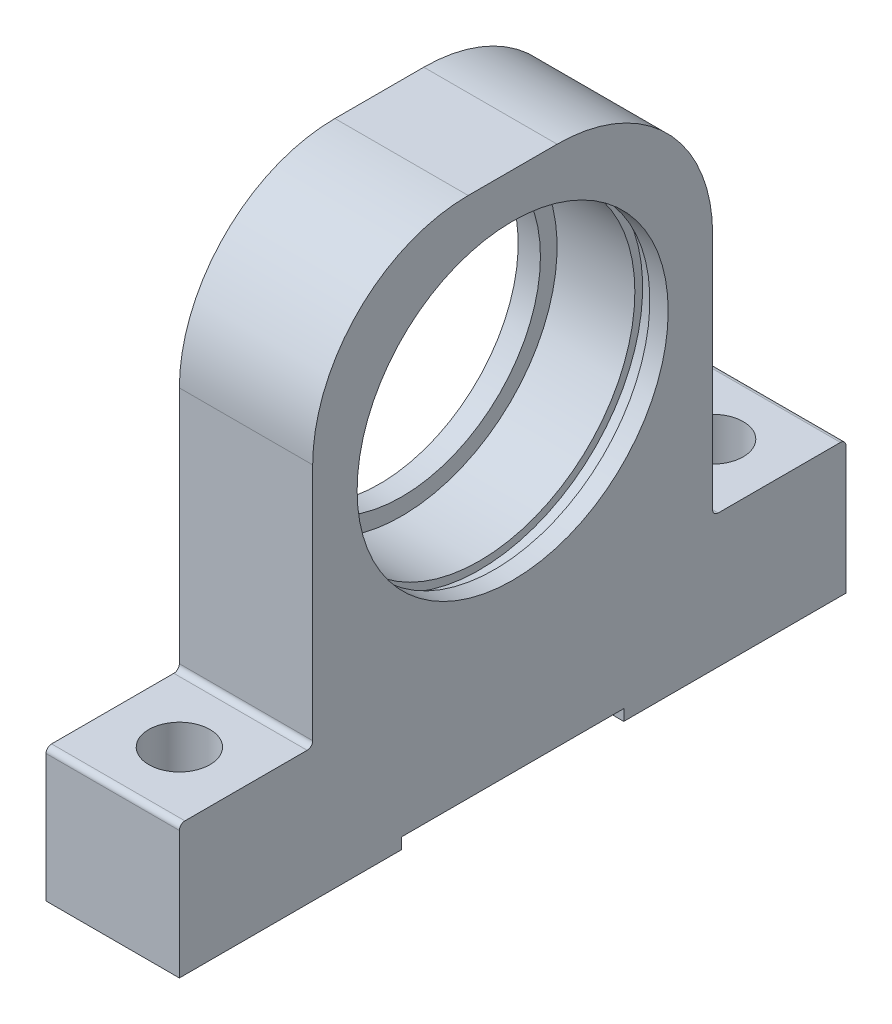
ISO-10303-21;
HEADER;
FILE_DESCRIPTION(('STEP AP214'),'2;1');
FILE_NAME('part.step','',(''),(''),'','','');
FILE_SCHEMA(('AUTOMOTIVE_DESIGN { 1 0 10303 214 1 1 1 1 }'));
ENDSEC;
DATA;
#1=APPLICATION_CONTEXT('core data for automotive mechanical design processes');
#2=APPLICATION_PROTOCOL_DEFINITION('international standard','automotive_design',2000,#1);
#3=PRODUCT_CONTEXT('',#1,'mechanical');
#4=PRODUCT('Part','Part','',(#3));
#5=PRODUCT_RELATED_PRODUCT_CATEGORY('part','',(#4));
#6=PRODUCT_DEFINITION_FORMATION('','',#4);
#7=PRODUCT_DEFINITION_CONTEXT('part definition',#1,'design');
#8=PRODUCT_DEFINITION('design','',#6,#7);
#9=PRODUCT_DEFINITION_SHAPE('','',#8);
#10=(LENGTH_UNIT() NAMED_UNIT(*) SI_UNIT(.MILLI.,.METRE.));
#11=(NAMED_UNIT(*) PLANE_ANGLE_UNIT() SI_UNIT($,.RADIAN.));
#12=(NAMED_UNIT(*) SI_UNIT($,.STERADIAN.) SOLID_ANGLE_UNIT());
#13=UNCERTAINTY_MEASURE_WITH_UNIT(LENGTH_MEASURE(1.E-05),#10,'distance_accuracy_value','');
#14=(GEOMETRIC_REPRESENTATION_CONTEXT(3) GLOBAL_UNCERTAINTY_ASSIGNED_CONTEXT((#13)) GLOBAL_UNIT_ASSIGNED_CONTEXT((#10,
#11,#12)) REPRESENTATION_CONTEXT('',''));
#15=CARTESIAN_POINT('',(0.,0.,0.));
#16=DIRECTION('',(0.,0.,1.));
#17=DIRECTION('',(1.,0.,0.));
#18=AXIS2_PLACEMENT_3D('',#15,#16,#17);
#19=CARTESIAN_POINT('',(6.,-18.5000000000009,29.4999999999991));
#20=DIRECTION('',(-1.,0.,0.));
#21=DIRECTION('',(0.,0.,1.));
#22=AXIS2_PLACEMENT_3D('',#19,#20,#21);
#23=CYLINDRICAL_SURFACE('',#22,0.500000000000927);
#24=CARTESIAN_POINT('',(-6.,-18.5000000000009,29.4999999999991));
#25=DIRECTION('',(1.,0.,0.));
#26=DIRECTION('',(0.,1.,1.89714910447595E-12));
#27=AXIS2_PLACEMENT_3D('',#24,#25,#26);
#28=CIRCLE('',#27,0.500000000000927);
#29=CARTESIAN_POINT('',(-6.,-18.,29.5));
#30=VERTEX_POINT('',#29);
#31=CARTESIAN_POINT('',(-6.,-18.5000000000005,30.));
#32=VERTEX_POINT('',#31);
#33=EDGE_CURVE('E144',#30,#32,#28,.T.);
#34=ORIENTED_EDGE('',*,*,#33,.T.);
#35=DIRECTION('',(1.,0.,0.));
#36=VECTOR('',#35,1.);
#37=CARTESIAN_POINT('',(-6.,-18.5000000000005,30.));
#38=LINE('',#37,#36);
#39=CARTESIAN_POINT('',(6.,-18.5000000000005,30.));
#40=VERTEX_POINT('',#39);
#41=EDGE_CURVE('E158',#40,#32,#38,.F.);
#42=ORIENTED_EDGE('',*,*,#41,.F.);
#43=CARTESIAN_POINT('',(6.,-18.5000000000009,29.4999999999991));
#44=DIRECTION('',(-1.,0.,0.));
#45=DIRECTION('',(0.,9.45021838559181E-13,1.));
#46=AXIS2_PLACEMENT_3D('',#43,#44,#45);
#47=CIRCLE('',#46,0.500000000000927);
#48=CARTESIAN_POINT('',(6.,-18.,29.5));
#49=VERTEX_POINT('',#48);
#50=EDGE_CURVE('E164',#49,#40,#47,.F.);
#51=ORIENTED_EDGE('',*,*,#50,.F.);
#52=DIRECTION('',(-1.,0.,0.));
#53=VECTOR('',#52,1.);
#54=CARTESIAN_POINT('',(6.,-18.,29.5));
#55=LINE('',#54,#53);
#56=EDGE_CURVE('E152',#49,#30,#55,.T.);
#57=ORIENTED_EDGE('',*,*,#56,.T.);
#58=EDGE_LOOP('',(#34,#42,#51,#57));
#59=FACE_BOUND('',#58,.T.);
#60=ADVANCED_FACE('F17',(#59),#23,.T.);
#61=CARTESIAN_POINT('',(6.,-30.,30.));
#62=DIRECTION('',(0.,0.,1.));
#63=DIRECTION('',(0.,1.,0.));
#64=AXIS2_PLACEMENT_3D('',#61,#62,#63);
#65=PLANE('',#64);
#66=DIRECTION('',(0.,-1.,0.));
#67=VECTOR('',#66,1.);
#68=CARTESIAN_POINT('',(-6.,-18.5000000000005,30.));
#69=LINE('',#68,#67);
#70=CARTESIAN_POINT('',(-6.,-30.,30.));
#71=VERTEX_POINT('',#70);
#72=EDGE_CURVE('E140',#32,#71,#69,.T.);
#73=ORIENTED_EDGE('',*,*,#72,.T.);
#74=DIRECTION('',(1.,0.,0.));
#75=VECTOR('',#74,1.);
#76=CARTESIAN_POINT('',(-6.,-30.,30.));
#77=LINE('',#76,#75);
#78=CARTESIAN_POINT('',(6.,-30.,30.));
#79=VERTEX_POINT('',#78);
#80=EDGE_CURVE('E151',#79,#71,#77,.F.);
#81=ORIENTED_EDGE('',*,*,#80,.F.);
#82=DIRECTION('',(0.,1.,0.));
#83=VECTOR('',#82,1.);
#84=CARTESIAN_POINT('',(6.,-30.,30.));
#85=LINE('',#84,#83);
#86=EDGE_CURVE('E163',#40,#79,#85,.F.);
#87=ORIENTED_EDGE('',*,*,#86,.F.);
#88=ORIENTED_EDGE('',*,*,#41,.T.);
#89=EDGE_LOOP('',(#73,#81,#87,#88));
#90=FACE_BOUND('',#89,.T.);
#91=ADVANCED_FACE('F162',(#90),#65,.T.);
#92=CARTESIAN_POINT('',(-6.,-30.,10.));
#93=DIRECTION('',(0.,-1.,0.));
#94=DIRECTION('',(1.,0.,0.));
#95=AXIS2_PLACEMENT_3D('',#92,#93,#94);
#96=PLANE('',#95);
#97=DIRECTION('',(0.,0.,-1.));
#98=VECTOR('',#97,1.);
#99=CARTESIAN_POINT('',(-6.,-30.,30.));
#100=LINE('',#99,#98);
#101=CARTESIAN_POINT('',(-6.,-30.,10.));
#102=VERTEX_POINT('',#101);
#103=EDGE_CURVE('E146',#71,#102,#100,.T.);
#104=ORIENTED_EDGE('',*,*,#103,.T.);
#105=DIRECTION('',(1.,0.,0.));
#106=VECTOR('',#105,1.);
#107=CARTESIAN_POINT('',(-6.,-30.,10.));
#108=LINE('',#107,#106);
#109=CARTESIAN_POINT('',(6.,-30.,10.));
#110=VERTEX_POINT('',#109);
#111=EDGE_CURVE('E186',#110,#102,#108,.F.);
#112=ORIENTED_EDGE('',*,*,#111,.F.);
#113=DIRECTION('',(0.,0.,1.));
#114=VECTOR('',#113,1.);
#115=CARTESIAN_POINT('',(6.,-30.,10.));
#116=LINE('',#115,#114);
#117=EDGE_CURVE('E191',#79,#110,#116,.F.);
#118=ORIENTED_EDGE('',*,*,#117,.F.);
#119=ORIENTED_EDGE('',*,*,#80,.T.);
#120=EDGE_LOOP('',(#104,#112,#118,#119));
#121=FACE_BOUND('',#120,.T.);
#122=CARTESIAN_POINT('',(0.,-30.,24.));
#123=DIRECTION('',(0.,1.,0.));
#124=DIRECTION('',(0.,0.,-1.));
#125=AXIS2_PLACEMENT_3D('',#122,#123,#124);
#126=CIRCLE('',#125,2.75);
#127=CARTESIAN_POINT('',(0.,-30.,21.25));
#128=VERTEX_POINT('',#127);
#129=EDGE_CURVE('E195',#128,#128,#126,.F.);
#130=ORIENTED_EDGE('',*,*,#129,.F.);
#131=EDGE_LOOP('',(#130));
#132=FACE_BOUND('',#131,.T.);
#133=ADVANCED_FACE('F453',(#121,#132),#96,.T.);
#134=CARTESIAN_POINT('',(-6.,-30.,10.));
#135=DIRECTION('',(0.,0.,-1.));
#136=DIRECTION('',(0.,1.,0.));
#137=AXIS2_PLACEMENT_3D('',#134,#135,#136);
#138=PLANE('',#137);
#139=DIRECTION('',(0.,1.,0.));
#140=VECTOR('',#139,1.);
#141=CARTESIAN_POINT('',(-6.,-30.,10.));
#142=LINE('',#141,#140);
#143=CARTESIAN_POINT('',(-6.,-29.,10.));
#144=VERTEX_POINT('',#143);
#145=EDGE_CURVE('E200',#102,#144,#142,.T.);
#146=ORIENTED_EDGE('',*,*,#145,.T.);
#147=DIRECTION('',(1.,0.,0.));
#148=VECTOR('',#147,1.);
#149=CARTESIAN_POINT('',(-6.,-29.,10.));
#150=LINE('',#149,#148);
#151=CARTESIAN_POINT('',(6.,-29.,10.));
#152=VERTEX_POINT('',#151);
#153=EDGE_CURVE('E203',#152,#144,#150,.F.);
#154=ORIENTED_EDGE('',*,*,#153,.F.);
#155=DIRECTION('',(0.,-1.,0.));
#156=VECTOR('',#155,1.);
#157=CARTESIAN_POINT('',(6.,-29.,10.));
#158=LINE('',#157,#156);
#159=EDGE_CURVE('E208',#110,#152,#158,.F.);
#160=ORIENTED_EDGE('',*,*,#159,.F.);
#161=ORIENTED_EDGE('',*,*,#111,.T.);
#162=EDGE_LOOP('',(#146,#154,#160,#161));
#163=FACE_BOUND('',#162,.T.);
#164=ADVANCED_FACE('F458',(#163),#138,.T.);
#165=CARTESIAN_POINT('',(-6.,-29.,-10.));
#166=DIRECTION('',(0.,-1.,0.));
#167=DIRECTION('',(1.,0.,0.));
#168=AXIS2_PLACEMENT_3D('',#165,#166,#167);
#169=PLANE('',#168);
#170=DIRECTION('',(0.,0.,-1.));
#171=VECTOR('',#170,1.);
#172=CARTESIAN_POINT('',(-6.,-29.,10.));
#173=LINE('',#172,#171);
#174=CARTESIAN_POINT('',(-6.,-29.,-10.));
#175=VERTEX_POINT('',#174);
#176=EDGE_CURVE('E212',#144,#175,#173,.T.);
#177=ORIENTED_EDGE('',*,*,#176,.T.);
#178=DIRECTION('',(1.,0.,0.));
#179=VECTOR('',#178,1.);
#180=CARTESIAN_POINT('',(-6.,-29.,-10.));
#181=LINE('',#180,#179);
#182=CARTESIAN_POINT('',(6.,-29.,-10.));
#183=VERTEX_POINT('',#182);
#184=EDGE_CURVE('E217',#183,#175,#181,.F.);
#185=ORIENTED_EDGE('',*,*,#184,.F.);
#186=DIRECTION('',(0.,0.,1.));
#187=VECTOR('',#186,1.);
#188=CARTESIAN_POINT('',(6.,-29.,-10.));
#189=LINE('',#188,#187);
#190=EDGE_CURVE('E222',#152,#183,#189,.F.);
#191=ORIENTED_EDGE('',*,*,#190,.F.);
#192=ORIENTED_EDGE('',*,*,#153,.T.);
#193=EDGE_LOOP('',(#177,#185,#191,#192));
#194=FACE_BOUND('',#193,.T.);
#195=ADVANCED_FACE('F462',(#194),#169,.T.);
#196=CARTESIAN_POINT('',(6.,-30.,-10.));
#197=DIRECTION('',(0.,0.,1.));
#198=DIRECTION('',(0.,1.,0.));
#199=AXIS2_PLACEMENT_3D('',#196,#197,#198);
#200=PLANE('',#199);
#201=DIRECTION('',(0.,-1.,0.));
#202=VECTOR('',#201,1.);
#203=CARTESIAN_POINT('',(-6.,-29.,-10.));
#204=LINE('',#203,#202);
#205=CARTESIAN_POINT('',(-6.,-30.,-10.));
#206=VERTEX_POINT('',#205);
#207=EDGE_CURVE('E226',#175,#206,#204,.T.);
#208=ORIENTED_EDGE('',*,*,#207,.T.);
#209=DIRECTION('',(1.,0.,0.));
#210=VECTOR('',#209,1.);
#211=CARTESIAN_POINT('',(-6.,-30.,-10.));
#212=LINE('',#211,#210);
#213=CARTESIAN_POINT('',(6.,-30.,-10.));
#214=VERTEX_POINT('',#213);
#215=EDGE_CURVE('E231',#214,#206,#212,.F.);
#216=ORIENTED_EDGE('',*,*,#215,.F.);
#217=DIRECTION('',(0.,1.,0.));
#218=VECTOR('',#217,1.);
#219=CARTESIAN_POINT('',(6.,-30.,-10.));
#220=LINE('',#219,#218);
#221=EDGE_CURVE('E236',#183,#214,#220,.F.);
#222=ORIENTED_EDGE('',*,*,#221,.F.);
#223=ORIENTED_EDGE('',*,*,#184,.T.);
#224=EDGE_LOOP('',(#208,#216,#222,#223));
#225=FACE_BOUND('',#224,.T.);
#226=ADVANCED_FACE('F466',(#225),#200,.T.);
#227=CARTESIAN_POINT('',(-6.,-30.,-30.));
#228=DIRECTION('',(0.,-1.,0.));
#229=DIRECTION('',(1.,0.,0.));
#230=AXIS2_PLACEMENT_3D('',#227,#228,#229);
#231=PLANE('',#230);
#232=DIRECTION('',(0.,0.,-1.));
#233=VECTOR('',#232,1.);
#234=CARTESIAN_POINT('',(-6.,-30.,-10.));
#235=LINE('',#234,#233);
#236=CARTESIAN_POINT('',(-6.,-30.,-30.));
#237=VERTEX_POINT('',#236);
#238=EDGE_CURVE('E240',#206,#237,#235,.T.);
#239=ORIENTED_EDGE('',*,*,#238,.T.);
#240=DIRECTION('',(1.,0.,0.));
#241=VECTOR('',#240,1.);
#242=CARTESIAN_POINT('',(-6.,-30.,-30.));
#243=LINE('',#242,#241);
#244=CARTESIAN_POINT('',(6.,-30.,-30.));
#245=VERTEX_POINT('',#244);
#246=EDGE_CURVE('E245',#245,#237,#243,.F.);
#247=ORIENTED_EDGE('',*,*,#246,.F.);
#248=DIRECTION('',(0.,0.,1.));
#249=VECTOR('',#248,1.);
#250=CARTESIAN_POINT('',(6.,-30.,-30.));
#251=LINE('',#250,#249);
#252=EDGE_CURVE('E250',#214,#245,#251,.F.);
#253=ORIENTED_EDGE('',*,*,#252,.F.);
#254=ORIENTED_EDGE('',*,*,#215,.T.);
#255=EDGE_LOOP('',(#239,#247,#253,#254));
#256=FACE_BOUND('',#255,.T.);
#257=CARTESIAN_POINT('',(0.,-30.,-24.));
#258=DIRECTION('',(0.,1.,0.));
#259=DIRECTION('',(0.,0.,-1.));
#260=AXIS2_PLACEMENT_3D('',#257,#258,#259);
#261=CIRCLE('',#260,2.75);
#262=CARTESIAN_POINT('',(0.,-30.,-26.75));
#263=VERTEX_POINT('',#262);
#264=EDGE_CURVE('E254',#263,#263,#261,.F.);
#265=ORIENTED_EDGE('',*,*,#264,.F.);
#266=EDGE_LOOP('',(#265));
#267=FACE_BOUND('',#266,.T.);
#268=ADVANCED_FACE('F470',(#256,#267),#231,.T.);
#269=CARTESIAN_POINT('',(-6.,-30.,-30.));
#270=DIRECTION('',(0.,0.,-1.));
#271=DIRECTION('',(0.,1.,0.));
#272=AXIS2_PLACEMENT_3D('',#269,#270,#271);
#273=PLANE('',#272);
#274=DIRECTION('',(0.,1.,0.));
#275=VECTOR('',#274,1.);
#276=CARTESIAN_POINT('',(-6.,-30.,-30.));
#277=LINE('',#276,#275);
#278=CARTESIAN_POINT('',(-6.,-18.5,-30.));
#279=VERTEX_POINT('',#278);
#280=EDGE_CURVE('E259',#237,#279,#277,.T.);
#281=ORIENTED_EDGE('',*,*,#280,.T.);
#282=DIRECTION('',(1.,0.,0.));
#283=VECTOR('',#282,1.);
#284=CARTESIAN_POINT('',(-6.,-18.5,-30.));
#285=LINE('',#284,#283);
#286=CARTESIAN_POINT('',(6.,-18.5000000000002,-30.));
#287=VERTEX_POINT('',#286);
#288=EDGE_CURVE('E262',#287,#279,#285,.F.);
#289=ORIENTED_EDGE('',*,*,#288,.F.);
#290=DIRECTION('',(0.,-1.,0.));
#291=VECTOR('',#290,1.);
#292=CARTESIAN_POINT('',(6.,-18.5000000000002,-30.));
#293=LINE('',#292,#291);
#294=EDGE_CURVE('E267',#245,#287,#293,.F.);
#295=ORIENTED_EDGE('',*,*,#294,.F.);
#296=ORIENTED_EDGE('',*,*,#246,.T.);
#297=EDGE_LOOP('',(#281,#289,#295,#296));
#298=FACE_BOUND('',#297,.T.);
#299=ADVANCED_FACE('F474',(#298),#273,.T.);
#300=CARTESIAN_POINT('',(6.,-18.5000000000009,-29.4999999999991));
#301=DIRECTION('',(-1.,0.,0.));
#302=DIRECTION('',(0.,1.,-1.89664378292966E-12));
#303=AXIS2_PLACEMENT_3D('',#300,#301,#302);
#304=CYLINDRICAL_SURFACE('',#303,0.500000000000927);
#305=CARTESIAN_POINT('',(-6.,-18.5000000000009,-29.4999999999991));
#306=DIRECTION('',(1.,0.,0.));
#307=DIRECTION('',(0.,1.79767312146972E-12,-1.));
#308=AXIS2_PLACEMENT_3D('',#305,#306,#307);
#309=CIRCLE('',#308,0.500000000000927);
#310=CARTESIAN_POINT('',(-6.,-18.,-29.5));
#311=VERTEX_POINT('',#310);
#312=EDGE_CURVE('E271',#279,#311,#309,.T.);
#313=ORIENTED_EDGE('',*,*,#312,.T.);
#314=DIRECTION('',(1.,0.,0.));
#315=VECTOR('',#314,1.);
#316=CARTESIAN_POINT('',(-6.,-18.,-29.5));
#317=LINE('',#316,#315);
#318=CARTESIAN_POINT('',(6.,-18.,-29.5));
#319=VERTEX_POINT('',#318);
#320=EDGE_CURVE('E276',#319,#311,#317,.F.);
#321=ORIENTED_EDGE('',*,*,#320,.F.);
#322=CARTESIAN_POINT('',(6.,-18.5000000000009,-29.4999999999991));
#323=DIRECTION('',(-1.,0.,0.));
#324=DIRECTION('',(0.,1.,-1.89714910447595E-12));
#325=AXIS2_PLACEMENT_3D('',#322,#323,#324);
#326=CIRCLE('',#325,0.500000000000927);
#327=EDGE_CURVE('E281',#287,#319,#326,.F.);
#328=ORIENTED_EDGE('',*,*,#327,.F.);
#329=ORIENTED_EDGE('',*,*,#288,.T.);
#330=EDGE_LOOP('',(#313,#321,#328,#329));
#331=FACE_BOUND('',#330,.T.);
#332=ADVANCED_FACE('F478',(#331),#304,.T.);
#333=CARTESIAN_POINT('',(-6.,-18.,-18.5));
#334=DIRECTION('',(0.,1.,0.));
#335=DIRECTION('',(1.,0.,0.));
#336=AXIS2_PLACEMENT_3D('',#333,#334,#335);
#337=PLANE('',#336);
#338=DIRECTION('',(0.,0.,1.));
#339=VECTOR('',#338,1.);
#340=CARTESIAN_POINT('',(-6.,-18.,-29.5));
#341=LINE('',#340,#339);
#342=CARTESIAN_POINT('',(-6.,-18.,-18.5));
#343=VERTEX_POINT('',#342);
#344=EDGE_CURVE('E285',#311,#343,#341,.T.);
#345=ORIENTED_EDGE('',*,*,#344,.T.);
#346=DIRECTION('',(1.,0.,0.));
#347=VECTOR('',#346,1.);
#348=CARTESIAN_POINT('',(-6.,-18.,-18.5));
#349=LINE('',#348,#347);
#350=CARTESIAN_POINT('',(6.,-18.,-18.5));
#351=VERTEX_POINT('',#350);
#352=EDGE_CURVE('E290',#351,#343,#349,.F.);
#353=ORIENTED_EDGE('',*,*,#352,.F.);
#354=DIRECTION('',(0.,0.,-1.));
#355=VECTOR('',#354,1.);
#356=CARTESIAN_POINT('',(6.,-18.,-18.5));
#357=LINE('',#356,#355);
#358=EDGE_CURVE('E295',#319,#351,#357,.F.);
#359=ORIENTED_EDGE('',*,*,#358,.F.);
#360=ORIENTED_EDGE('',*,*,#320,.T.);
#361=EDGE_LOOP('',(#345,#353,#359,#360));
#362=FACE_BOUND('',#361,.T.);
#363=CARTESIAN_POINT('',(0.,-18.,-24.));
#364=DIRECTION('',(0.,-1.,0.));
#365=DIRECTION('',(0.,0.,1.));
#366=AXIS2_PLACEMENT_3D('',#363,#364,#365);
#367=CIRCLE('',#366,2.75);
#368=CARTESIAN_POINT('',(0.,-18.,-21.25));
#369=VERTEX_POINT('',#368);
#370=EDGE_CURVE('E299',#369,#369,#367,.T.);
#371=ORIENTED_EDGE('',*,*,#370,.T.);
#372=EDGE_LOOP('',(#371));
#373=FACE_BOUND('',#372,.T.);
#374=ADVANCED_FACE('F482',(#362,#373),#337,.T.);
#375=CARTESIAN_POINT('',(6.,-17.4999999999991,-18.5000000000009));
#376=DIRECTION('',(-1.,0.,0.));
#377=DIRECTION('',(0.,-1.,1.8969654074596E-12));
#378=AXIS2_PLACEMENT_3D('',#375,#376,#377);
#379=CYLINDRICAL_SURFACE('',#378,0.500000000000937);
#380=CARTESIAN_POINT('',(-6.,-17.4999999999991,-18.5000000000009));
#381=DIRECTION('',(-1.,0.,0.));
#382=DIRECTION('',(0.,-1.,1.91135995919108E-12));
#383=AXIS2_PLACEMENT_3D('',#380,#381,#382);
#384=CIRCLE('',#383,0.500000000000937);
#385=CARTESIAN_POINT('',(-6.,-17.4999999999995,-18.));
#386=VERTEX_POINT('',#385);
#387=EDGE_CURVE('E304',#386,#343,#384,.F.);
#388=ORIENTED_EDGE('',*,*,#387,.F.);
#389=DIRECTION('',(1.,0.,0.));
#390=VECTOR('',#389,1.);
#391=CARTESIAN_POINT('',(-6.,-17.4999999999995,-18.));
#392=LINE('',#391,#390);
#393=CARTESIAN_POINT('',(6.,-17.4999999999995,-18.));
#394=VERTEX_POINT('',#393);
#395=EDGE_CURVE('E306',#394,#386,#392,.F.);
#396=ORIENTED_EDGE('',*,*,#395,.F.);
#397=CARTESIAN_POINT('',(6.,-17.4999999999991,-18.5000000000009));
#398=DIRECTION('',(1.,0.,0.));
#399=DIRECTION('',(0.,-9.45021838559161E-13,1.));
#400=AXIS2_PLACEMENT_3D('',#397,#398,#399);
#401=CIRCLE('',#400,0.500000000000937);
#402=EDGE_CURVE('E311',#394,#351,#401,.T.);
#403=ORIENTED_EDGE('',*,*,#402,.T.);
#404=ORIENTED_EDGE('',*,*,#352,.T.);
#405=EDGE_LOOP('',(#388,#396,#403,#404));
#406=FACE_BOUND('',#405,.T.);
#407=ADVANCED_FACE('F486',(#406),#379,.F.);
#408=CARTESIAN_POINT('',(-6.,-17.4999999999995,-18.));
#409=DIRECTION('',(0.,0.,-1.));
#410=DIRECTION('',(0.,1.,0.));
#411=AXIS2_PLACEMENT_3D('',#408,#409,#410);
#412=PLANE('',#411);
#413=DIRECTION('',(0.,1.,0.));
#414=VECTOR('',#413,1.);
#415=CARTESIAN_POINT('',(-6.,-17.4999999999995,-18.));
#416=LINE('',#415,#414);
#417=CARTESIAN_POINT('',(-6.,4.00000000000027,-18.));
#418=VERTEX_POINT('',#417);
#419=EDGE_CURVE('E316',#386,#418,#416,.T.);
#420=ORIENTED_EDGE('',*,*,#419,.T.);
#421=DIRECTION('',(1.,0.,0.));
#422=VECTOR('',#421,1.);
#423=CARTESIAN_POINT('',(-6.,4.00000000000027,-18.));
#424=LINE('',#423,#422);
#425=CARTESIAN_POINT('',(6.,4.00000000000029,-18.));
#426=VERTEX_POINT('',#425);
#427=EDGE_CURVE('E321',#426,#418,#424,.F.);
#428=ORIENTED_EDGE('',*,*,#427,.F.);
#429=DIRECTION('',(0.,-1.,0.));
#430=VECTOR('',#429,1.);
#431=CARTESIAN_POINT('',(6.,4.00000000000029,-18.));
#432=LINE('',#431,#430);
#433=EDGE_CURVE('E326',#394,#426,#432,.F.);
#434=ORIENTED_EDGE('',*,*,#433,.F.);
#435=ORIENTED_EDGE('',*,*,#395,.T.);
#436=EDGE_LOOP('',(#420,#428,#434,#435));
#437=FACE_BOUND('',#436,.T.);
#438=ADVANCED_FACE('F490',(#437),#412,.T.);
#439=CARTESIAN_POINT('',(6.,4.00000000000113,-4.00000000000113));
#440=DIRECTION('',(-1.,0.,0.));
#441=DIRECTION('',(0.,1.,0.));
#442=AXIS2_PLACEMENT_3D('',#439,#440,#441);
#443=CYLINDRICAL_SURFACE('',#442,13.9999999999989);
#444=CARTESIAN_POINT('',(-6.,4.00000000000113,-4.00000000000113));
#445=DIRECTION('',(1.,0.,0.));
#446=DIRECTION('',(0.,0.,-1.));
#447=AXIS2_PLACEMENT_3D('',#444,#445,#446);
#448=CIRCLE('',#447,13.9999999999989);
#449=CARTESIAN_POINT('',(-6.,18.,-4.00000000000072));
#450=VERTEX_POINT('',#449);
#451=EDGE_CURVE('E330',#418,#450,#448,.T.);
#452=ORIENTED_EDGE('',*,*,#451,.T.);
#453=DIRECTION('',(1.,0.,0.));
#454=VECTOR('',#453,1.);
#455=CARTESIAN_POINT('',(-6.,18.,-4.00000000000072));
#456=LINE('',#455,#454);
#457=CARTESIAN_POINT('',(6.,18.,-4.00000000000029));
#458=VERTEX_POINT('',#457);
#459=EDGE_CURVE('E335',#458,#450,#456,.F.);
#460=ORIENTED_EDGE('',*,*,#459,.F.);
#461=CARTESIAN_POINT('',(6.,4.00000000000113,-4.00000000000113));
#462=DIRECTION('',(-1.,0.,0.));
#463=DIRECTION('',(0.,1.,0.));
#464=AXIS2_PLACEMENT_3D('',#461,#462,#463);
#465=CIRCLE('',#464,13.9999999999989);
#466=EDGE_CURVE('E340',#426,#458,#465,.F.);
#467=ORIENTED_EDGE('',*,*,#466,.F.);
#468=ORIENTED_EDGE('',*,*,#427,.T.);
#469=EDGE_LOOP('',(#452,#460,#467,#468));
#470=FACE_BOUND('',#469,.T.);
#471=ADVANCED_FACE('F494',(#470),#443,.T.);
#472=CARTESIAN_POINT('',(-6.,18.,4.));
#473=DIRECTION('',(0.,1.,0.));
#474=DIRECTION('',(1.,0.,0.));
#475=AXIS2_PLACEMENT_3D('',#472,#473,#474);
#476=PLANE('',#475);
#477=DIRECTION('',(0.,0.,1.));
#478=VECTOR('',#477,1.);
#479=CARTESIAN_POINT('',(-6.,18.,-4.00000000000072));
#480=LINE('',#479,#478);
#481=CARTESIAN_POINT('',(-6.,18.,4.));
#482=VERTEX_POINT('',#481);
#483=EDGE_CURVE('E344',#450,#482,#480,.T.);
#484=ORIENTED_EDGE('',*,*,#483,.T.);
#485=DIRECTION('',(1.,0.,0.));
#486=VECTOR('',#485,1.);
#487=CARTESIAN_POINT('',(-6.,18.,4.));
#488=LINE('',#487,#486);
#489=CARTESIAN_POINT('',(6.,18.,4.));
#490=VERTEX_POINT('',#489);
#491=EDGE_CURVE('E349',#490,#482,#488,.F.);
#492=ORIENTED_EDGE('',*,*,#491,.F.);
#493=DIRECTION('',(0.,0.,-1.));
#494=VECTOR('',#493,1.);
#495=CARTESIAN_POINT('',(6.,18.,4.));
#496=LINE('',#495,#494);
#497=EDGE_CURVE('E354',#458,#490,#496,.F.);
#498=ORIENTED_EDGE('',*,*,#497,.F.);
#499=ORIENTED_EDGE('',*,*,#459,.T.);
#500=EDGE_LOOP('',(#484,#492,#498,#499));
#501=FACE_BOUND('',#500,.T.);
#502=ADVANCED_FACE('F498',(#501),#476,.T.);
#503=CARTESIAN_POINT('',(6.,4.00000000000113,4.00000000000113));
#504=DIRECTION('',(-1.,0.,0.));
#505=DIRECTION('',(0.,0.,1.));
#506=AXIS2_PLACEMENT_3D('',#503,#504,#505);
#507=CYLINDRICAL_SURFACE('',#506,13.9999999999989);
#508=CARTESIAN_POINT('',(-6.,4.00000000000113,4.00000000000113));
#509=DIRECTION('',(1.,0.,0.));
#510=DIRECTION('',(0.,1.,0.));
#511=AXIS2_PLACEMENT_3D('',#508,#509,#510);
#512=CIRCLE('',#511,13.9999999999989);
#513=CARTESIAN_POINT('',(-6.,4.00000000000085,18.));
#514=VERTEX_POINT('',#513);
#515=EDGE_CURVE('E358',#482,#514,#512,.T.);
#516=ORIENTED_EDGE('',*,*,#515,.T.);
#517=DIRECTION('',(1.,0.,0.));
#518=VECTOR('',#517,1.);
#519=CARTESIAN_POINT('',(-6.,4.00000000000085,18.));
#520=LINE('',#519,#518);
#521=CARTESIAN_POINT('',(6.,4.00000000000056,18.));
#522=VERTEX_POINT('',#521);
#523=EDGE_CURVE('E363',#522,#514,#520,.F.);
#524=ORIENTED_EDGE('',*,*,#523,.F.);
#525=CARTESIAN_POINT('',(6.,4.00000000000113,4.00000000000113));
#526=DIRECTION('',(-1.,0.,0.));
#527=DIRECTION('',(0.,0.,1.));
#528=AXIS2_PLACEMENT_3D('',#525,#526,#527);
#529=CIRCLE('',#528,13.9999999999989);
#530=EDGE_CURVE('E368',#490,#522,#529,.F.);
#531=ORIENTED_EDGE('',*,*,#530,.F.);
#532=ORIENTED_EDGE('',*,*,#491,.T.);
#533=EDGE_LOOP('',(#516,#524,#531,#532));
#534=FACE_BOUND('',#533,.T.);
#535=ADVANCED_FACE('F502',(#534),#507,.T.);
#536=CARTESIAN_POINT('',(6.,-17.5,18.));
#537=DIRECTION('',(0.,0.,1.));
#538=DIRECTION('',(0.,1.,0.));
#539=AXIS2_PLACEMENT_3D('',#536,#537,#538);
#540=PLANE('',#539);
#541=DIRECTION('',(0.,-1.,0.));
#542=VECTOR('',#541,1.);
#543=CARTESIAN_POINT('',(-6.,4.00000000000085,18.));
#544=LINE('',#543,#542);
#545=CARTESIAN_POINT('',(-6.,-17.5,18.));
#546=VERTEX_POINT('',#545);
#547=EDGE_CURVE('E372',#514,#546,#544,.T.);
#548=ORIENTED_EDGE('',*,*,#547,.T.);
#549=DIRECTION('',(1.,0.,0.));
#550=VECTOR('',#549,1.);
#551=CARTESIAN_POINT('',(-6.,-17.5,18.));
#552=LINE('',#551,#550);
#553=CARTESIAN_POINT('',(6.,-17.4999999999998,18.));
#554=VERTEX_POINT('',#553);
#555=EDGE_CURVE('E377',#554,#546,#552,.F.);
#556=ORIENTED_EDGE('',*,*,#555,.F.);
#557=DIRECTION('',(0.,1.,0.));
#558=VECTOR('',#557,1.);
#559=CARTESIAN_POINT('',(6.,-17.4999999999998,18.));
#560=LINE('',#559,#558);
#561=EDGE_CURVE('E382',#522,#554,#560,.F.);
#562=ORIENTED_EDGE('',*,*,#561,.F.);
#563=ORIENTED_EDGE('',*,*,#523,.T.);
#564=EDGE_LOOP('',(#548,#556,#562,#563));
#565=FACE_BOUND('',#564,.T.);
#566=ADVANCED_FACE('F506',(#565),#540,.T.);
#567=CARTESIAN_POINT('',(6.,-17.4999999999991,18.5000000000009));
#568=DIRECTION('',(-1.,0.,0.));
#569=DIRECTION('',(0.,-1.42096300684029E-12,-1.));
#570=AXIS2_PLACEMENT_3D('',#567,#568,#569);
#571=CYLINDRICAL_SURFACE('',#570,0.500000000000934);
#572=CARTESIAN_POINT('',(-6.,-17.4999999999991,18.5000000000009));
#573=DIRECTION('',(-1.,0.,0.));
#574=DIRECTION('',(0.,-1.9113599591911E-12,-1.));
#575=AXIS2_PLACEMENT_3D('',#572,#573,#574);
#576=CIRCLE('',#575,0.500000000000934);
#577=CARTESIAN_POINT('',(-6.,-18.,18.5));
#578=VERTEX_POINT('',#577);
#579=EDGE_CURVE('E386',#578,#546,#576,.F.);
#580=ORIENTED_EDGE('',*,*,#579,.F.);
#581=DIRECTION('',(1.,0.,0.));
#582=VECTOR('',#581,1.);
#583=CARTESIAN_POINT('',(-6.,-18.,18.5));
#584=LINE('',#583,#582);
#585=CARTESIAN_POINT('',(6.,-18.,18.5));
#586=VERTEX_POINT('',#585);
#587=EDGE_CURVE('E390',#586,#578,#584,.F.);
#588=ORIENTED_EDGE('',*,*,#587,.F.);
#589=CARTESIAN_POINT('',(6.,-17.4999999999991,18.5000000000009));
#590=DIRECTION('',(1.,0.,0.));
#591=DIRECTION('',(0.,-1.,-1.89714910447592E-12));
#592=AXIS2_PLACEMENT_3D('',#589,#590,#591);
#593=CIRCLE('',#592,0.500000000000934);
#594=EDGE_CURVE('E32',#586,#554,#593,.T.);
#595=ORIENTED_EDGE('',*,*,#594,.T.);
#596=ORIENTED_EDGE('',*,*,#555,.T.);
#597=EDGE_LOOP('',(#580,#588,#595,#596));
#598=FACE_BOUND('',#597,.T.);
#599=ADVANCED_FACE('F510',(#598),#571,.F.);
#600=CARTESIAN_POINT('',(-6.,-18.,29.5));
#601=DIRECTION('',(0.,1.,0.));
#602=DIRECTION('',(1.,0.,0.));
#603=AXIS2_PLACEMENT_3D('',#600,#601,#602);
#604=PLANE('',#603);
#605=DIRECTION('',(0.,0.,1.));
#606=VECTOR('',#605,1.);
#607=CARTESIAN_POINT('',(-6.,-18.,18.5));
#608=LINE('',#607,#606);
#609=EDGE_CURVE('E40',#578,#30,#608,.T.);
#610=ORIENTED_EDGE('',*,*,#609,.T.);
#611=ORIENTED_EDGE('',*,*,#56,.F.);
#612=DIRECTION('',(0.,0.,-1.));
#613=VECTOR('',#612,1.);
#614=CARTESIAN_POINT('',(6.,-18.,29.5));
#615=LINE('',#614,#613);
#616=EDGE_CURVE('E401',#586,#49,#615,.F.);
#617=ORIENTED_EDGE('',*,*,#616,.F.);
#618=ORIENTED_EDGE('',*,*,#587,.T.);
#619=EDGE_LOOP('',(#610,#611,#617,#618));
#620=FACE_BOUND('',#619,.T.);
#621=CARTESIAN_POINT('',(0.,-18.,24.));
#622=DIRECTION('',(0.,-1.,0.));
#623=DIRECTION('',(0.,0.,1.));
#624=AXIS2_PLACEMENT_3D('',#621,#622,#623);
#625=CIRCLE('',#624,2.75);
#626=CARTESIAN_POINT('',(0.,-18.,26.75));
#627=VERTEX_POINT('',#626);
#628=EDGE_CURVE('E405',#627,#627,#625,.T.);
#629=ORIENTED_EDGE('',*,*,#628,.T.);
#630=EDGE_LOOP('',(#629));
#631=FACE_BOUND('',#630,.T.);
#632=ADVANCED_FACE('F514',(#620,#631),#604,.T.);
#633=CARTESIAN_POINT('',(6.,-30.,30.));
#634=DIRECTION('',(1.,0.,0.));
#635=DIRECTION('',(0.,0.,-1.));
#636=AXIS2_PLACEMENT_3D('',#633,#634,#635);
#637=PLANE('',#636);
#638=ORIENTED_EDGE('',*,*,#50,.T.);
#639=ORIENTED_EDGE('',*,*,#86,.T.);
#640=ORIENTED_EDGE('',*,*,#117,.T.);
#641=ORIENTED_EDGE('',*,*,#159,.T.);
#642=ORIENTED_EDGE('',*,*,#190,.T.);
#643=ORIENTED_EDGE('',*,*,#221,.T.);
#644=ORIENTED_EDGE('',*,*,#252,.T.);
#645=ORIENTED_EDGE('',*,*,#294,.T.);
#646=ORIENTED_EDGE('',*,*,#327,.T.);
#647=ORIENTED_EDGE('',*,*,#358,.T.);
#648=ORIENTED_EDGE('',*,*,#402,.F.);
#649=ORIENTED_EDGE('',*,*,#433,.T.);
#650=ORIENTED_EDGE('',*,*,#466,.T.);
#651=ORIENTED_EDGE('',*,*,#497,.T.);
#652=ORIENTED_EDGE('',*,*,#530,.T.);
#653=ORIENTED_EDGE('',*,*,#561,.T.);
#654=ORIENTED_EDGE('',*,*,#594,.F.);
#655=ORIENTED_EDGE('',*,*,#616,.T.);
#656=EDGE_LOOP('',(#638,#639,#640,#641,#642,#643,#644,#645,#646,#647,#648,#649,#650,#651,#652,
#653,#654,#655));
#657=FACE_BOUND('',#656,.T.);
#658=CARTESIAN_POINT('',(6.,0.,0.));
#659=DIRECTION('',(-1.,0.,0.));
#660=DIRECTION('',(0.,0.,-1.));
#661=AXIS2_PLACEMENT_3D('',#658,#659,#660);
#662=CIRCLE('',#661,14.);
#663=CARTESIAN_POINT('',(6.,0.,-14.));
#664=VERTEX_POINT('',#663);
#665=EDGE_CURVE('E410',#664,#664,#662,.F.);
#666=ORIENTED_EDGE('',*,*,#665,.F.);
#667=EDGE_LOOP('',(#666));
#668=FACE_BOUND('',#667,.T.);
#669=ADVANCED_FACE('F518',(#657,#668),#637,.T.);
#670=CARTESIAN_POINT('',(-6.,-30.,30.));
#671=DIRECTION('',(-1.,0.,0.));
#672=DIRECTION('',(0.,1.,0.));
#673=AXIS2_PLACEMENT_3D('',#670,#671,#672);
#674=PLANE('',#673);
#675=ORIENTED_EDGE('',*,*,#33,.F.);
#676=ORIENTED_EDGE('',*,*,#609,.F.);
#677=ORIENTED_EDGE('',*,*,#579,.T.);
#678=ORIENTED_EDGE('',*,*,#547,.F.);
#679=ORIENTED_EDGE('',*,*,#515,.F.);
#680=ORIENTED_EDGE('',*,*,#483,.F.);
#681=ORIENTED_EDGE('',*,*,#451,.F.);
#682=ORIENTED_EDGE('',*,*,#419,.F.);
#683=ORIENTED_EDGE('',*,*,#387,.T.);
#684=ORIENTED_EDGE('',*,*,#344,.F.);
#685=ORIENTED_EDGE('',*,*,#312,.F.);
#686=ORIENTED_EDGE('',*,*,#280,.F.);
#687=ORIENTED_EDGE('',*,*,#238,.F.);
#688=ORIENTED_EDGE('',*,*,#207,.F.);
#689=ORIENTED_EDGE('',*,*,#176,.F.);
#690=ORIENTED_EDGE('',*,*,#145,.F.);
#691=ORIENTED_EDGE('',*,*,#103,.F.);
#692=ORIENTED_EDGE('',*,*,#72,.F.);
#693=EDGE_LOOP('',(#675,#676,#677,#678,#679,#680,#681,#682,#683,#684,#685,#686,#687,#688,#689,
#690,#691,#692));
#694=FACE_BOUND('',#693,.T.);
#695=CARTESIAN_POINT('',(-6.,0.,0.));
#696=DIRECTION('',(1.,0.,0.));
#697=DIRECTION('',(0.,-1.16851765596948E-09,1.));
#698=AXIS2_PLACEMENT_3D('',#695,#696,#697);
#699=CIRCLE('',#698,12.5);
#700=CARTESIAN_POINT('',(-6.,-1.46064706996185E-08,12.5));
#701=VERTEX_POINT('',#700);
#702=EDGE_CURVE('E413',#701,#701,#699,.T.);
#703=ORIENTED_EDGE('',*,*,#702,.T.);
#704=EDGE_LOOP('',(#703));
#705=FACE_BOUND('',#704,.T.);
#706=ADVANCED_FACE('F142',(#694,#705),#674,.T.);
#707=CARTESIAN_POINT('',(-4.,-14.260068812399,14.));
#708=DIRECTION('',(1.,0.,0.));
#709=DIRECTION('',(0.,0.,-1.));
#710=AXIS2_PLACEMENT_3D('',#707,#708,#709);
#711=PLANE('',#710);
#712=CARTESIAN_POINT('',(-4.,0.,0.));
#713=DIRECTION('',(1.,0.,0.));
#714=DIRECTION('',(0.,0.,1.));
#715=AXIS2_PLACEMENT_3D('',#712,#713,#714);
#716=CIRCLE('',#715,14.);
#717=CARTESIAN_POINT('',(-4.,0.,14.));
#718=VERTEX_POINT('',#717);
#719=EDGE_CURVE('E416',#718,#718,#716,.T.);
#720=ORIENTED_EDGE('',*,*,#719,.T.);
#721=EDGE_LOOP('',(#720));
#722=FACE_BOUND('',#721,.T.);
#723=CARTESIAN_POINT('',(-4.,0.,0.));
#724=DIRECTION('',(-1.,0.,0.));
#725=DIRECTION('',(0.,0.,-1.));
#726=AXIS2_PLACEMENT_3D('',#723,#724,#725);
#727=CIRCLE('',#726,12.5);
#728=CARTESIAN_POINT('',(-4.,0.,-12.5));
#729=VERTEX_POINT('',#728);
#730=EDGE_CURVE('E419',#729,#729,#727,.F.);
#731=ORIENTED_EDGE('',*,*,#730,.F.);
#732=EDGE_LOOP('',(#731));
#733=FACE_BOUND('',#732,.T.);
#734=ADVANCED_FACE('F524',(#722,#733),#711,.T.);
#735=CARTESIAN_POINT('',(3.,-14.9730722274429,14.7));
#736=DIRECTION('',(1.,0.,0.));
#737=DIRECTION('',(0.,0.,-1.));
#738=AXIS2_PLACEMENT_3D('',#735,#736,#737);
#739=PLANE('',#738);
#740=CARTESIAN_POINT('',(3.,0.,0.));
#741=DIRECTION('',(1.,0.,0.));
#742=DIRECTION('',(0.,-1.16855749566565E-09,1.));
#743=AXIS2_PLACEMENT_3D('',#740,#741,#742);
#744=CIRCLE('',#743,14.7);
#745=CARTESIAN_POINT('',(3.,-1.7177795186285E-08,14.7));
#746=VERTEX_POINT('',#745);
#747=EDGE_CURVE('E422',#746,#746,#744,.T.);
#748=ORIENTED_EDGE('',*,*,#747,.T.);
#749=EDGE_LOOP('',(#748));
#750=FACE_BOUND('',#749,.T.);
#751=CARTESIAN_POINT('',(3.,0.,0.));
#752=DIRECTION('',(-1.,0.,0.));
#753=DIRECTION('',(0.,0.,-1.));
#754=AXIS2_PLACEMENT_3D('',#751,#752,#753);
#755=CIRCLE('',#754,14.);
#756=CARTESIAN_POINT('',(3.,0.,-14.));
#757=VERTEX_POINT('',#756);
#758=EDGE_CURVE('E425',#757,#757,#755,.F.);
#759=ORIENTED_EDGE('',*,*,#758,.F.);
#760=EDGE_LOOP('',(#759));
#761=FACE_BOUND('',#760,.T.);
#762=ADVANCED_FACE('F437',(#750,#761),#739,.T.);
#763=CARTESIAN_POINT('',(4.35,-14.9730722443665,-14.7));
#764=DIRECTION('',(-1.,0.,0.));
#765=DIRECTION('',(0.,0.,1.));
#766=AXIS2_PLACEMENT_3D('',#763,#764,#765);
#767=PLANE('',#766);
#768=CARTESIAN_POINT('',(4.35,0.,0.));
#769=DIRECTION('',(-1.,0.,0.));
#770=DIRECTION('',(0.,0.,-1.));
#771=AXIS2_PLACEMENT_3D('',#768,#769,#770);
#772=CIRCLE('',#771,14.7);
#773=CARTESIAN_POINT('',(4.35,0.,-14.7));
#774=VERTEX_POINT('',#773);
#775=EDGE_CURVE('E25',#774,#774,#772,.F.);
#776=ORIENTED_EDGE('',*,*,#775,.F.);
#777=EDGE_LOOP('',(#776));
#778=FACE_BOUND('',#777,.T.);
#779=CARTESIAN_POINT('',(4.35,0.,0.));
#780=DIRECTION('',(1.,0.,0.));
#781=DIRECTION('',(0.,0.,1.));
#782=AXIS2_PLACEMENT_3D('',#779,#780,#781);
#783=CIRCLE('',#782,14.);
#784=CARTESIAN_POINT('',(4.35,0.,14.));
#785=VERTEX_POINT('',#784);
#786=EDGE_CURVE('E11',#785,#785,#783,.T.);
#787=ORIENTED_EDGE('',*,*,#786,.T.);
#788=EDGE_LOOP('',(#787));
#789=FACE_BOUND('',#788,.T.);
#790=ADVANCED_FACE('F433',(#778,#789),#767,.T.);
#791=CARTESIAN_POINT('',(0.,-30.,24.));
#792=DIRECTION('',(0.,-1.,0.));
#793=DIRECTION('',(1.42053898988588E-07,0.,0.99999999999999));
#794=AXIS2_PLACEMENT_3D('',#791,#792,#793);
#795=CYLINDRICAL_SURFACE('',#794,2.75);
#796=ORIENTED_EDGE('',*,*,#129,.T.);
#797=EDGE_LOOP('',(#796));
#798=FACE_BOUND('',#797,.T.);
#799=ORIENTED_EDGE('',*,*,#628,.F.);
#800=EDGE_LOOP('',(#799));
#801=FACE_BOUND('',#800,.T.);
#802=ADVANCED_FACE('F436',(#798,#801),#795,.F.);
#803=CARTESIAN_POINT('',(0.,-30.,-24.));
#804=DIRECTION('',(0.,-1.,0.));
#805=DIRECTION('',(1.42053898544499E-07,0.,0.99999999999999));
#806=AXIS2_PLACEMENT_3D('',#803,#804,#805);
#807=CYLINDRICAL_SURFACE('',#806,2.75);
#808=ORIENTED_EDGE('',*,*,#264,.T.);
#809=EDGE_LOOP('',(#808));
#810=FACE_BOUND('',#809,.T.);
#811=ORIENTED_EDGE('',*,*,#370,.F.);
#812=EDGE_LOOP('',(#811));
#813=FACE_BOUND('',#812,.T.);
#814=ADVANCED_FACE('F533',(#810,#813),#807,.F.);
#815=CARTESIAN_POINT('',(6.,0.,0.));
#816=DIRECTION('',(1.,0.,0.));
#817=DIRECTION('',(0.,0.,1.));
#818=AXIS2_PLACEMENT_3D('',#815,#816,#817);
#819=CYLINDRICAL_SURFACE('',#818,12.5);
#820=ORIENTED_EDGE('',*,*,#730,.T.);
#821=EDGE_LOOP('',(#820));
#822=FACE_BOUND('',#821,.T.);
#823=ORIENTED_EDGE('',*,*,#702,.F.);
#824=EDGE_LOOP('',(#823));
#825=FACE_BOUND('',#824,.T.);
#826=ADVANCED_FACE('F537',(#822,#825),#819,.F.);
#827=CARTESIAN_POINT('',(6.,0.,0.));
#828=DIRECTION('',(1.,0.,0.));
#829=DIRECTION('',(0.,0.,1.));
#830=AXIS2_PLACEMENT_3D('',#827,#828,#829);
#831=CYLINDRICAL_SURFACE('',#830,14.);
#832=ORIENTED_EDGE('',*,*,#758,.T.);
#833=EDGE_LOOP('',(#832));
#834=FACE_BOUND('',#833,.T.);
#835=ORIENTED_EDGE('',*,*,#719,.F.);
#836=EDGE_LOOP('',(#835));
#837=FACE_BOUND('',#836,.T.);
#838=ADVANCED_FACE('F447',(#834,#837),#831,.F.);
#839=CARTESIAN_POINT('',(6.,0.,0.));
#840=DIRECTION('',(1.,0.,0.));
#841=DIRECTION('',(0.,1.16855826160653E-09,1.));
#842=AXIS2_PLACEMENT_3D('',#839,#840,#841);
#843=CYLINDRICAL_SURFACE('',#842,14.7);
#844=ORIENTED_EDGE('',*,*,#775,.T.);
#845=EDGE_LOOP('',(#844));
#846=FACE_BOUND('',#845,.T.);
#847=ORIENTED_EDGE('',*,*,#747,.F.);
#848=EDGE_LOOP('',(#847));
#849=FACE_BOUND('',#848,.T.);
#850=ADVANCED_FACE('F430',(#846,#849),#843,.F.);
#851=CARTESIAN_POINT('',(6.,0.,0.));
#852=DIRECTION('',(1.,0.,0.));
#853=DIRECTION('',(0.,1.16851296450713E-09,1.));
#854=AXIS2_PLACEMENT_3D('',#851,#852,#853);
#855=CYLINDRICAL_SURFACE('',#854,14.);
#856=ORIENTED_EDGE('',*,*,#665,.T.);
#857=EDGE_LOOP('',(#856));
#858=FACE_BOUND('',#857,.T.);
#859=ORIENTED_EDGE('',*,*,#786,.F.);
#860=EDGE_LOOP('',(#859));
#861=FACE_BOUND('',#860,.T.);
#862=ADVANCED_FACE('F19',(#858,#861),#855,.F.);
#863=CLOSED_SHELL('',(#60,#91,#133,#164,#195,#226,#268,#299,#332,#374,#407,#438,#471,#502,#535,
#566,#599,#632,#669,#706,#734,#762,#790,#802,#814,#826,#838,#850,#862));
#864=MANIFOLD_SOLID_BREP('B1',#863);
#865=ADVANCED_BREP_SHAPE_REPRESENTATION('',(#18,#864),#14);
#866=SHAPE_DEFINITION_REPRESENTATION(#9,#865);
ENDSEC;
END-ISO-10303-21;
